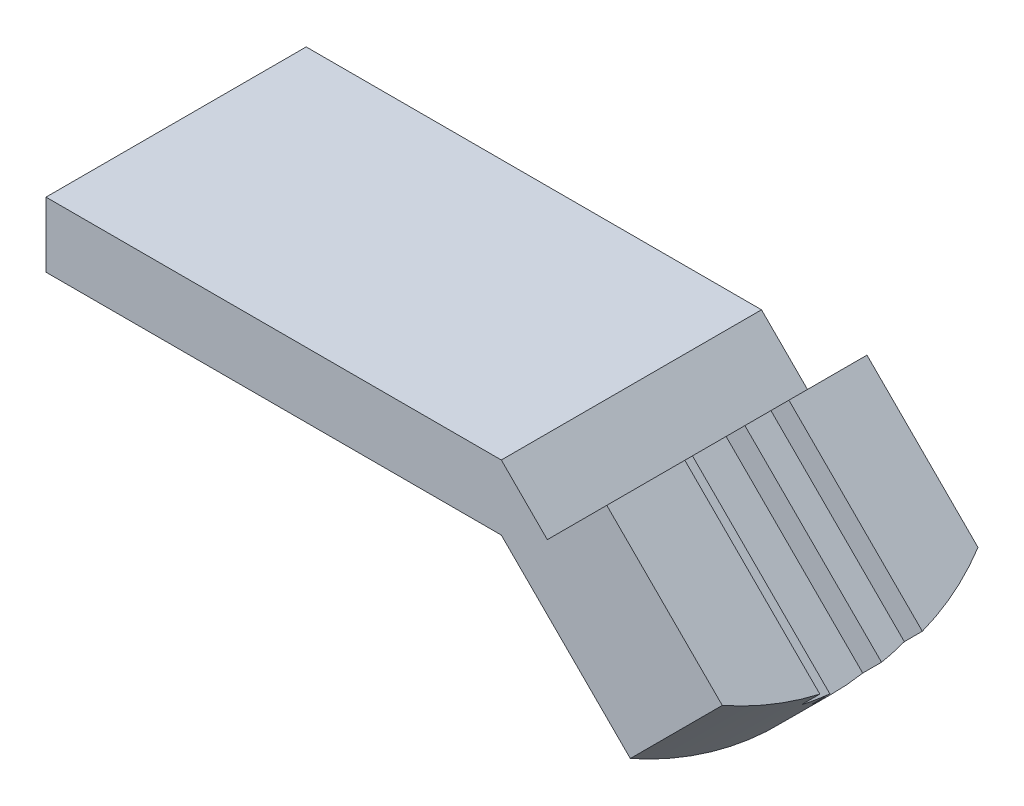
ISO-10303-21;
HEADER;
FILE_DESCRIPTION(('STEP AP214'),'2;1');
FILE_NAME('part.step','',(''),(''),'','','');
FILE_SCHEMA(('AUTOMOTIVE_DESIGN { 1 0 10303 214 1 1 1 1 }'));
ENDSEC;
DATA;
#1=APPLICATION_CONTEXT('core data for automotive mechanical design processes');
#2=APPLICATION_PROTOCOL_DEFINITION('international standard','automotive_design',2000,#1);
#3=PRODUCT_CONTEXT('',#1,'mechanical');
#4=PRODUCT('Part','Part','',(#3));
#5=PRODUCT_RELATED_PRODUCT_CATEGORY('part','',(#4));
#6=PRODUCT_DEFINITION_FORMATION('','',#4);
#7=PRODUCT_DEFINITION_CONTEXT('part definition',#1,'design');
#8=PRODUCT_DEFINITION('design','',#6,#7);
#9=PRODUCT_DEFINITION_SHAPE('','',#8);
#10=(LENGTH_UNIT() NAMED_UNIT(*) SI_UNIT(.MILLI.,.METRE.));
#11=(NAMED_UNIT(*) PLANE_ANGLE_UNIT() SI_UNIT($,.RADIAN.));
#12=(NAMED_UNIT(*) SI_UNIT($,.STERADIAN.) SOLID_ANGLE_UNIT());
#13=UNCERTAINTY_MEASURE_WITH_UNIT(LENGTH_MEASURE(1.E-05),#10,'distance_accuracy_value','');
#14=(GEOMETRIC_REPRESENTATION_CONTEXT(3) GLOBAL_UNCERTAINTY_ASSIGNED_CONTEXT((#13)) GLOBAL_UNIT_ASSIGNED_CONTEXT((#10,
#11,#12)) REPRESENTATION_CONTEXT('',''));
#15=CARTESIAN_POINT('',(0.,0.,0.));
#16=DIRECTION('',(0.,0.,1.));
#17=DIRECTION('',(1.,0.,0.));
#18=AXIS2_PLACEMENT_3D('',#15,#16,#17);
#19=CARTESIAN_POINT('',(53.7132034355964,-4.57106781186547,20.));
#20=DIRECTION('',(-0.707106781186548,-0.707106781186548,0.));
#21=DIRECTION('',(0.707106781186548,-0.707106781186548,0.));
#22=AXIS2_PLACEMENT_3D('',#19,#20,#21);
#23=PLANE('',#22);
#24=CARTESIAN_POINT('',(39.5710678118655,9.57106781186547,10.4207132266221));
#25=DIRECTION('',(-0.707106781186548,-0.707106781186548,0.));
#26=DIRECTION('',(0.707106781186548,-0.707106781186548,0.));
#27=AXIS2_PLACEMENT_3D('',#24,#25,#26);
#28=CIRCLE('',#27,20.);
#29=CARTESIAN_POINT('',(53.484886593816,-4.34275097008512,14.));
#30=VERTEX_POINT('',#29);
#31=CARTESIAN_POINT('',(51.985520375579,-2.84338475184804,20.));
#32=VERTEX_POINT('',#31);
#33=EDGE_CURVE('E172',#30,#32,#28,.T.);
#34=ORIENTED_EDGE('',*,*,#33,.F.);
#35=DIRECTION('',(-0.707106781186548,0.707106781186547,0.));
#36=VECTOR('',#35,1.);
#37=CARTESIAN_POINT('',(143.156261528053,-94.0141259043217,14.));
#38=LINE('',#37,#36);
#39=CARTESIAN_POINT('',(43.1066017177982,6.03553390593274,14.));
#40=VERTEX_POINT('',#39);
#41=EDGE_CURVE('E248',#30,#40,#38,.T.);
#42=ORIENTED_EDGE('',*,*,#41,.T.);
#43=DIRECTION('',(0.,0.,-1.));
#44=VECTOR('',#43,1.);
#45=CARTESIAN_POINT('',(43.1066017177982,6.03553390593274,20.));
#46=LINE('',#45,#44);
#47=CARTESIAN_POINT('',(43.1066017177982,6.03553390593274,20.));
#48=VERTEX_POINT('',#47);
#49=EDGE_CURVE('E210',#48,#40,#46,.T.);
#50=ORIENTED_EDGE('',*,*,#49,.F.);
#51=DIRECTION('',(-0.707106781186548,0.707106781186548,0.));
#52=VECTOR('',#51,1.);
#53=CARTESIAN_POINT('',(53.7132034355964,-4.57106781186547,20.));
#54=LINE('',#53,#52);
#55=EDGE_CURVE('E286',#32,#48,#54,.T.);
#56=ORIENTED_EDGE('',*,*,#55,.F.);
#57=EDGE_LOOP('',(#34,#42,#50,#56));
#58=FACE_BOUND('',#57,.T.);
#59=ADVANCED_FACE('F39',(#58),#23,.F.);
#60=CARTESIAN_POINT('',(39.5710678118655,9.57106781186547,10.4207132266221));
#61=DIRECTION('',(-0.707106781186548,-0.707106781186548,0.));
#62=DIRECTION('',(0.707106781186548,-0.707106781186548,0.));
#63=AXIS2_PLACEMENT_3D('',#60,#61,#62);
#64=CIRCLE('',#63,20.);
#65=CARTESIAN_POINT('',(51.6418742440908,-2.49973862035986,0.));
#66=VERTEX_POINT('',#65);
#67=CARTESIAN_POINT('',(53.3634079789286,-4.22127235519772,6.));
#68=VERTEX_POINT('',#67);
#69=EDGE_CURVE('E55',#66,#68,#64,.T.);
#70=ORIENTED_EDGE('',*,*,#69,.F.);
#71=DIRECTION('',(-0.707106781186548,0.707106781186548,0.));
#72=VECTOR('',#71,1.);
#73=CARTESIAN_POINT('',(53.7132034355964,-4.57106781186547,0.));
#74=LINE('',#73,#72);
#75=CARTESIAN_POINT('',(43.1066017177982,6.03553390593274,0.));
#76=VERTEX_POINT('',#75);
#77=EDGE_CURVE('E168',#66,#76,#74,.T.);
#78=ORIENTED_EDGE('',*,*,#77,.T.);
#79=CARTESIAN_POINT('',(43.1066017177982,6.03553390593274,6.));
#80=VERTEX_POINT('',#79);
#81=EDGE_CURVE('E209',#80,#76,#46,.T.);
#82=ORIENTED_EDGE('',*,*,#81,.F.);
#83=DIRECTION('',(-0.707106781186548,0.707106781186547,0.));
#84=VECTOR('',#83,1.);
#85=CARTESIAN_POINT('',(143.156261528053,-94.0141259043217,6.));
#86=LINE('',#85,#84);
#87=EDGE_CURVE('E170',#68,#80,#86,.T.);
#88=ORIENTED_EDGE('',*,*,#87,.F.);
#89=EDGE_LOOP('',(#70,#78,#82,#88));
#90=FACE_BOUND('',#89,.T.);
#91=ADVANCED_FACE('F166',(#90),#23,.F.);
#92=CARTESIAN_POINT('',(35.,0.,20.));
#93=DIRECTION('',(0.707106781186548,0.707106781186548,0.));
#94=DIRECTION('',(-0.707106781186548,0.707106781186548,0.));
#95=AXIS2_PLACEMENT_3D('',#92,#93,#94);
#96=PLANE('',#95);
#97=CARTESIAN_POINT('',(32.5,2.5,10.4207132266221));
#98=DIRECTION('',(0.707106781186548,0.707106781186548,0.));
#99=DIRECTION('',(-0.707106781186548,0.707106781186548,0.));
#100=AXIS2_PLACEMENT_3D('',#97,#98,#99);
#101=CIRCLE('',#100,20.);
#102=CARTESIAN_POINT('',(44.9144525637135,-9.91445256371352,20.));
#103=VERTEX_POINT('',#102);
#104=CARTESIAN_POINT('',(44.5708064322253,-9.57080643222532,0.));
#105=VERTEX_POINT('',#104);
#106=EDGE_CURVE('E156',#103,#105,#101,.T.);
#107=ORIENTED_EDGE('',*,*,#106,.F.);
#108=DIRECTION('',(0.707106781186548,-0.707106781186548,0.));
#109=VECTOR('',#108,1.);
#110=CARTESIAN_POINT('',(35.,0.,20.));
#111=LINE('',#110,#109);
#112=CARTESIAN_POINT('',(35.,0.,20.));
#113=VERTEX_POINT('',#112);
#114=EDGE_CURVE('E282',#113,#103,#111,.T.);
#115=ORIENTED_EDGE('',*,*,#114,.F.);
#116=DIRECTION('',(0.,0.,-1.));
#117=VECTOR('',#116,1.);
#118=CARTESIAN_POINT('',(35.,0.,20.));
#119=LINE('',#118,#117);
#120=CARTESIAN_POINT('',(35.,0.,0.));
#121=VERTEX_POINT('',#120);
#122=EDGE_CURVE('E214',#113,#121,#119,.T.);
#123=ORIENTED_EDGE('',*,*,#122,.T.);
#124=DIRECTION('',(0.707106781186548,-0.707106781186548,0.));
#125=VECTOR('',#124,1.);
#126=CARTESIAN_POINT('',(35.,0.,0.));
#127=LINE('',#126,#125);
#128=EDGE_CURVE('E180',#121,#105,#127,.T.);
#129=ORIENTED_EDGE('',*,*,#128,.T.);
#130=EDGE_LOOP('',(#107,#115,#123,#129));
#131=FACE_BOUND('',#130,.T.);
#132=ADVANCED_FACE('F307',(#131),#96,.F.);
#133=CARTESIAN_POINT('',(0.,0.,20.));
#134=DIRECTION('',(0.,0.,1.));
#135=DIRECTION('',(1.,0.,0.));
#136=AXIS2_PLACEMENT_3D('',#133,#134,#135);
#137=PLANE('',#136);
#138=ORIENTED_EDGE('',*,*,#114,.T.);
#139=DIRECTION('',(-0.707106781186548,-0.707106781186547,0.));
#140=VECTOR('',#139,1.);
#141=CARTESIAN_POINT('',(105.000908938372,50.1720038109446,20.));
#142=LINE('',#141,#140);
#143=EDGE_CURVE('E162',#32,#103,#142,.T.);
#144=ORIENTED_EDGE('',*,*,#143,.F.);
#145=ORIENTED_EDGE('',*,*,#55,.T.);
#146=DIRECTION('',(-0.707106781186547,-0.707106781186548,0.));
#147=VECTOR('',#146,1.);
#148=CARTESIAN_POINT('',(43.1066017177982,6.03553390593274,20.));
#149=LINE('',#148,#147);
#150=CARTESIAN_POINT('',(38.5355339059327,1.46446609406726,20.));
#151=VERTEX_POINT('',#150);
#152=EDGE_CURVE('E289',#48,#151,#149,.T.);
#153=ORIENTED_EDGE('',*,*,#152,.T.);
#154=DIRECTION('',(-0.707106781186547,0.707106781186548,0.));
#155=VECTOR('',#154,1.);
#156=CARTESIAN_POINT('',(35.,5.,20.));
#157=LINE('',#156,#155);
#158=CARTESIAN_POINT('',(35.,5.,20.));
#159=VERTEX_POINT('',#158);
#160=EDGE_CURVE('E292',#151,#159,#157,.T.);
#161=ORIENTED_EDGE('',*,*,#160,.T.);
#162=DIRECTION('',(-1.,0.,0.));
#163=VECTOR('',#162,1.);
#164=CARTESIAN_POINT('',(0.,5.,20.));
#165=LINE('',#164,#163);
#166=CARTESIAN_POINT('',(0.,5.,20.));
#167=VERTEX_POINT('',#166);
#168=EDGE_CURVE('E201',#159,#167,#165,.T.);
#169=ORIENTED_EDGE('',*,*,#168,.T.);
#170=DIRECTION('',(0.,-1.,0.));
#171=VECTOR('',#170,1.);
#172=CARTESIAN_POINT('',(0.,5.,20.));
#173=LINE('',#172,#171);
#174=CARTESIAN_POINT('',(0.,0.,20.));
#175=VERTEX_POINT('',#174);
#176=EDGE_CURVE('E195',#167,#175,#173,.T.);
#177=ORIENTED_EDGE('',*,*,#176,.T.);
#178=DIRECTION('',(1.,0.,0.));
#179=VECTOR('',#178,1.);
#180=CARTESIAN_POINT('',(0.,0.,20.));
#181=LINE('',#180,#179);
#182=EDGE_CURVE('E279',#175,#113,#181,.T.);
#183=ORIENTED_EDGE('',*,*,#182,.T.);
#184=EDGE_LOOP('',(#138,#144,#145,#153,#161,#169,#177,#183));
#185=FACE_BOUND('',#184,.T.);
#186=ADVANCED_FACE('F310',(#185),#137,.T.);
#187=CARTESIAN_POINT('',(0.,0.,0.));
#188=DIRECTION('',(0.,0.,1.));
#189=DIRECTION('',(1.,0.,0.));
#190=AXIS2_PLACEMENT_3D('',#187,#188,#189);
#191=PLANE('',#190);
#192=DIRECTION('',(-0.707106781186548,-0.707106781186547,0.));
#193=VECTOR('',#192,1.);
#194=CARTESIAN_POINT('',(104.657262806883,50.5156499424328,0.));
#195=LINE('',#194,#193);
#196=EDGE_CURVE('E152',#66,#105,#195,.T.);
#197=ORIENTED_EDGE('',*,*,#196,.T.);
#198=ORIENTED_EDGE('',*,*,#128,.F.);
#199=DIRECTION('',(1.,0.,0.));
#200=VECTOR('',#199,1.);
#201=CARTESIAN_POINT('',(0.,0.,0.));
#202=LINE('',#201,#200);
#203=CARTESIAN_POINT('',(0.,0.,0.));
#204=VERTEX_POINT('',#203);
#205=EDGE_CURVE('E186',#204,#121,#202,.T.);
#206=ORIENTED_EDGE('',*,*,#205,.F.);
#207=DIRECTION('',(0.,-1.,0.));
#208=VECTOR('',#207,1.);
#209=CARTESIAN_POINT('',(0.,5.,0.));
#210=LINE('',#209,#208);
#211=CARTESIAN_POINT('',(0.,5.,0.));
#212=VERTEX_POINT('',#211);
#213=EDGE_CURVE('E275',#212,#204,#210,.T.);
#214=ORIENTED_EDGE('',*,*,#213,.F.);
#215=DIRECTION('',(-1.,0.,0.));
#216=VECTOR('',#215,1.);
#217=CARTESIAN_POINT('',(0.,5.,0.));
#218=LINE('',#217,#216);
#219=CARTESIAN_POINT('',(35.,5.,0.));
#220=VERTEX_POINT('',#219);
#221=EDGE_CURVE('E192',#220,#212,#218,.T.);
#222=ORIENTED_EDGE('',*,*,#221,.F.);
#223=DIRECTION('',(-0.707106781186547,0.707106781186548,0.));
#224=VECTOR('',#223,1.);
#225=CARTESIAN_POINT('',(35.,5.,0.));
#226=LINE('',#225,#224);
#227=CARTESIAN_POINT('',(38.5355339059327,1.46446609406726,0.));
#228=VERTEX_POINT('',#227);
#229=EDGE_CURVE('E184',#228,#220,#226,.T.);
#230=ORIENTED_EDGE('',*,*,#229,.F.);
#231=DIRECTION('',(-0.707106781186547,-0.707106781186548,0.));
#232=VECTOR('',#231,1.);
#233=CARTESIAN_POINT('',(43.1066017177982,6.03553390593274,0.));
#234=LINE('',#233,#232);
#235=EDGE_CURVE('E178',#76,#228,#234,.T.);
#236=ORIENTED_EDGE('',*,*,#235,.F.);
#237=ORIENTED_EDGE('',*,*,#77,.F.);
#238=EDGE_LOOP('',(#197,#198,#206,#214,#222,#230,#236,#237));
#239=FACE_BOUND('',#238,.T.);
#240=ADVANCED_FACE('F176',(#239),#191,.F.);
#241=CARTESIAN_POINT('',(143.156261528053,-94.0141259043217,14.));
#242=DIRECTION('',(0.,0.,-1.));
#243=DIRECTION('',(-1.,0.,0.));
#244=AXIS2_PLACEMENT_3D('',#241,#242,#243);
#245=PLANE('',#244);
#246=ORIENTED_EDGE('',*,*,#41,.F.);
#247=DIRECTION('',(-0.707106781186548,-0.707106781186547,0.));
#248=VECTOR('',#247,1.);
#249=CARTESIAN_POINT('',(106.500275156609,48.6726375927075,14.));
#250=LINE('',#249,#248);
#251=CARTESIAN_POINT('',(52.0706730314429,-5.75696453245822,14.));
#252=VERTEX_POINT('',#251);
#253=EDGE_CURVE('E173',#30,#252,#250,.T.);
#254=ORIENTED_EDGE('',*,*,#253,.T.);
#255=DIRECTION('',(-0.707106781186548,0.707106781186547,0.));
#256=VECTOR('',#255,1.);
#257=CARTESIAN_POINT('',(141.74204796568,-95.4283394666949,14.));
#258=LINE('',#257,#256);
#259=CARTESIAN_POINT('',(41.6923881554251,4.62132034355962,14.));
#260=VERTEX_POINT('',#259);
#261=EDGE_CURVE('E62',#252,#260,#258,.T.);
#262=ORIENTED_EDGE('',*,*,#261,.T.);
#263=DIRECTION('',(0.707106781186547,0.707106781186548,0.));
#264=VECTOR('',#263,1.);
#265=CARTESIAN_POINT('',(43.1066017177982,6.03553390593274,14.));
#266=LINE('',#265,#264);
#267=EDGE_CURVE('E48',#260,#40,#266,.T.);
#268=ORIENTED_EDGE('',*,*,#267,.T.);
#269=EDGE_LOOP('',(#246,#254,#262,#268));
#270=FACE_BOUND('',#269,.T.);
#271=ADVANCED_FACE('F247',(#270),#245,.T.);
#272=CARTESIAN_POINT('',(141.74204796568,-95.4283394666949,14.));
#273=DIRECTION('',(0.707106781186547,0.707106781186548,0.));
#274=DIRECTION('',(-0.707106781186548,0.707106781186547,0.));
#275=AXIS2_PLACEMENT_3D('',#272,#273,#274);
#276=PLANE('',#275);
#277=ORIENTED_EDGE('',*,*,#261,.F.);
#278=CARTESIAN_POINT('',(38.1568542494924,8.15685424949235,10.4207132266221));
#279=DIRECTION('',(0.707106781186547,0.707106781186548,0.));
#280=DIRECTION('',(-0.707106781186548,0.707106781186547,0.));
#281=AXIS2_PLACEMENT_3D('',#278,#279,#280);
#282=CIRCLE('',#281,20.);
#283=CARTESIAN_POINT('',(52.254830226338,-5.94112172735326,12.));
#284=VERTEX_POINT('',#283);
#285=EDGE_CURVE('E260',#252,#284,#282,.T.);
#286=ORIENTED_EDGE('',*,*,#285,.T.);
#287=DIRECTION('',(-0.707106781186548,0.707106781186547,0.));
#288=VECTOR('',#287,1.);
#289=CARTESIAN_POINT('',(141.74204796568,-95.4283394666949,12.));
#290=LINE('',#289,#288);
#291=CARTESIAN_POINT('',(41.6923881554251,4.62132034355963,12.));
#292=VERTEX_POINT('',#291);
#293=EDGE_CURVE('E259',#284,#292,#290,.T.);
#294=ORIENTED_EDGE('',*,*,#293,.T.);
#295=DIRECTION('',(0.,0.,1.));
#296=VECTOR('',#295,1.);
#297=CARTESIAN_POINT('',(41.6923881554251,4.62132034355962,20.));
#298=LINE('',#297,#296);
#299=EDGE_CURVE('E242',#292,#260,#298,.T.);
#300=ORIENTED_EDGE('',*,*,#299,.T.);
#301=EDGE_LOOP('',(#277,#286,#294,#300));
#302=FACE_BOUND('',#301,.T.);
#303=ADVANCED_FACE('F256',(#302),#276,.T.);
#304=CARTESIAN_POINT('',(140.327834403307,-96.8425530290679,12.));
#305=DIRECTION('',(0.,0.,-1.));
#306=DIRECTION('',(-1.,0.,0.));
#307=AXIS2_PLACEMENT_3D('',#304,#305,#306);
#308=PLANE('',#307);
#309=ORIENTED_EDGE('',*,*,#293,.F.);
#310=DIRECTION('',(-0.707106781186548,-0.707106781186547,0.));
#311=VECTOR('',#310,1.);
#312=CARTESIAN_POINT('',(106.684432351504,48.4884803978124,12.));
#313=LINE('',#312,#311);
#314=CARTESIAN_POINT('',(50.8406166639649,-7.35533528972635,12.));
#315=VERTEX_POINT('',#314);
#316=EDGE_CURVE('E366',#284,#315,#313,.T.);
#317=ORIENTED_EDGE('',*,*,#316,.T.);
#318=DIRECTION('',(-0.707106781186548,0.707106781186547,0.));
#319=VECTOR('',#318,1.);
#320=CARTESIAN_POINT('',(140.327834403307,-96.8425530290679,12.));
#321=LINE('',#320,#319);
#322=CARTESIAN_POINT('',(40.278174593052,3.20710678118653,12.));
#323=VERTEX_POINT('',#322);
#324=EDGE_CURVE('E264',#315,#323,#321,.T.);
#325=ORIENTED_EDGE('',*,*,#324,.T.);
#326=DIRECTION('',(0.707106781186547,0.707106781186548,0.));
#327=VECTOR('',#326,1.);
#328=CARTESIAN_POINT('',(43.1066017177982,6.03553390593274,12.));
#329=LINE('',#328,#327);
#330=EDGE_CURVE('E238',#323,#292,#329,.T.);
#331=ORIENTED_EDGE('',*,*,#330,.T.);
#332=EDGE_LOOP('',(#309,#317,#325,#331));
#333=FACE_BOUND('',#332,.T.);
#334=ADVANCED_FACE('F407',(#333),#308,.T.);
#335=CARTESIAN_POINT('',(140.327834403307,-96.8425530290679,12.));
#336=DIRECTION('',(0.707106781186547,0.707106781186548,0.));
#337=DIRECTION('',(-0.707106781186548,0.707106781186547,0.));
#338=AXIS2_PLACEMENT_3D('',#335,#336,#337);
#339=PLANE('',#338);
#340=ORIENTED_EDGE('',*,*,#324,.F.);
#341=CARTESIAN_POINT('',(36.7426406871193,6.74264068711928,10.4207132266221));
#342=DIRECTION('',(0.707106781186547,0.707106781186548,0.));
#343=DIRECTION('',(-0.707106781186548,0.707106781186547,0.));
#344=AXIS2_PLACEMENT_3D('',#341,#342,#343);
#345=CIRCLE('',#344,20.);
#346=CARTESIAN_POINT('',(50.7808055863227,-7.29552421208419,8.));
#347=VERTEX_POINT('',#346);
#348=EDGE_CURVE('E347',#315,#347,#345,.T.);
#349=ORIENTED_EDGE('',*,*,#348,.T.);
#350=DIRECTION('',(-0.707106781186548,0.707106781186547,0.));
#351=VECTOR('',#350,1.);
#352=CARTESIAN_POINT('',(140.327834403307,-96.8425530290679,8.));
#353=LINE('',#352,#351);
#354=CARTESIAN_POINT('',(40.278174593052,3.20710678118652,8.));
#355=VERTEX_POINT('',#354);
#356=EDGE_CURVE('E269',#347,#355,#353,.T.);
#357=ORIENTED_EDGE('',*,*,#356,.T.);
#358=DIRECTION('',(0.,0.,1.));
#359=VECTOR('',#358,1.);
#360=CARTESIAN_POINT('',(40.278174593052,3.20710678118653,20.));
#361=LINE('',#360,#359);
#362=EDGE_CURVE('E234',#355,#323,#361,.T.);
#363=ORIENTED_EDGE('',*,*,#362,.T.);
#364=EDGE_LOOP('',(#340,#349,#357,#363));
#365=FACE_BOUND('',#364,.T.);
#366=ADVANCED_FACE('F346',(#365),#339,.T.);
#367=CARTESIAN_POINT('',(140.327834403307,-96.8425530290679,8.));
#368=DIRECTION('',(0.,0.,1.));
#369=DIRECTION('',(1.,0.,0.));
#370=AXIS2_PLACEMENT_3D('',#367,#368,#369);
#371=PLANE('',#370);
#372=ORIENTED_EDGE('',*,*,#356,.F.);
#373=DIRECTION('',(-0.707106781186548,-0.707106781186547,0.));
#374=VECTOR('',#373,1.);
#375=CARTESIAN_POINT('',(106.624621273862,48.5482914754546,8.));
#376=LINE('',#375,#374);
#377=CARTESIAN_POINT('',(52.2260539809139,-5.85027581749302,8.));
#378=VERTEX_POINT('',#377);
#379=EDGE_CURVE('E352',#347,#378,#376,.F.);
#380=ORIENTED_EDGE('',*,*,#379,.T.);
#381=DIRECTION('',(-0.707106781186548,0.707106781186547,0.));
#382=VECTOR('',#381,1.);
#383=CARTESIAN_POINT('',(141.773082797898,-95.3973046344768,8.));
#384=LINE('',#383,#382);
#385=CARTESIAN_POINT('',(41.7234229876432,4.65235517577771,8.));
#386=VERTEX_POINT('',#385);
#387=EDGE_CURVE('E333',#378,#386,#384,.T.);
#388=ORIENTED_EDGE('',*,*,#387,.T.);
#389=DIRECTION('',(-0.707106781186547,-0.707106781186548,0.));
#390=VECTOR('',#389,1.);
#391=CARTESIAN_POINT('',(43.1066017177982,6.03553390593274,8.));
#392=LINE('',#391,#390);
#393=EDGE_CURVE('E230',#386,#355,#392,.T.);
#394=ORIENTED_EDGE('',*,*,#393,.T.);
#395=EDGE_LOOP('',(#372,#380,#388,#394));
#396=FACE_BOUND('',#395,.T.);
#397=ADVANCED_FACE('F350',(#396),#371,.T.);
#398=CARTESIAN_POINT('',(141.773082797898,-95.3973046344768,8.));
#399=DIRECTION('',(0.707106781186547,0.707106781186548,0.));
#400=DIRECTION('',(-0.707106781186548,0.707106781186547,0.));
#401=AXIS2_PLACEMENT_3D('',#398,#399,#400);
#402=PLANE('',#401);
#403=ORIENTED_EDGE('',*,*,#387,.F.);
#404=CARTESIAN_POINT('',(38.1878890817104,8.18788908171044,10.4207132266221));
#405=DIRECTION('',(0.707106781186547,0.707106781186548,0.));
#406=DIRECTION('',(-0.707106781186548,0.707106781186547,0.));
#407=AXIS2_PLACEMENT_3D('',#404,#405,#406);
#408=CIRCLE('',#407,20.);
#409=CARTESIAN_POINT('',(51.9802292487736,-5.60445108535274,6.));
#410=VERTEX_POINT('',#409);
#411=EDGE_CURVE('E356',#378,#410,#408,.T.);
#412=ORIENTED_EDGE('',*,*,#411,.T.);
#413=DIRECTION('',(-0.707106781186548,0.707106781186547,0.));
#414=VECTOR('',#413,1.);
#415=CARTESIAN_POINT('',(141.773082797898,-95.3973046344768,6.));
#416=LINE('',#415,#414);
#417=CARTESIAN_POINT('',(41.7234229876432,4.65235517577771,6.));
#418=VERTEX_POINT('',#417);
#419=EDGE_CURVE('E331',#410,#418,#416,.T.);
#420=ORIENTED_EDGE('',*,*,#419,.T.);
#421=DIRECTION('',(0.,0.,1.));
#422=VECTOR('',#421,1.);
#423=CARTESIAN_POINT('',(41.7234229876432,4.65235517577771,20.));
#424=LINE('',#423,#422);
#425=EDGE_CURVE('E226',#418,#386,#424,.T.);
#426=ORIENTED_EDGE('',*,*,#425,.T.);
#427=EDGE_LOOP('',(#403,#412,#420,#426));
#428=FACE_BOUND('',#427,.T.);
#429=ADVANCED_FACE('F355',(#428),#402,.T.);
#430=CARTESIAN_POINT('',(141.773082797898,-95.3973046344768,6.));
#431=DIRECTION('',(0.,0.,1.));
#432=DIRECTION('',(1.,0.,0.));
#433=AXIS2_PLACEMENT_3D('',#430,#431,#432);
#434=PLANE('',#433);
#435=ORIENTED_EDGE('',*,*,#419,.F.);
#436=DIRECTION('',(-0.707106781186548,-0.707106781186547,0.));
#437=VECTOR('',#436,1.);
#438=CARTESIAN_POINT('',(106.378796541721,48.7941162075949,6.));
#439=LINE('',#438,#437);
#440=EDGE_CURVE('E11',#410,#68,#439,.F.);
#441=ORIENTED_EDGE('',*,*,#440,.T.);
#442=ORIENTED_EDGE('',*,*,#87,.T.);
#443=DIRECTION('',(-0.707106781186547,-0.707106781186548,0.));
#444=VECTOR('',#443,1.);
#445=CARTESIAN_POINT('',(43.1066017177982,6.03553390593274,6.));
#446=LINE('',#445,#444);
#447=EDGE_CURVE('E222',#80,#418,#446,.T.);
#448=ORIENTED_EDGE('',*,*,#447,.T.);
#449=EDGE_LOOP('',(#435,#441,#442,#448));
#450=FACE_BOUND('',#449,.T.);
#451=ADVANCED_FACE('F330',(#450),#434,.T.);
#452=CARTESIAN_POINT('',(43.1066017177982,6.03553390593274,20.));
#453=DIRECTION('',(0.707106781186548,-0.707106781186547,0.));
#454=DIRECTION('',(0.707106781186547,0.707106781186548,0.));
#455=AXIS2_PLACEMENT_3D('',#452,#453,#454);
#456=PLANE('',#455);
#457=ORIENTED_EDGE('',*,*,#267,.F.);
#458=ORIENTED_EDGE('',*,*,#299,.F.);
#459=ORIENTED_EDGE('',*,*,#330,.F.);
#460=ORIENTED_EDGE('',*,*,#362,.F.);
#461=ORIENTED_EDGE('',*,*,#393,.F.);
#462=ORIENTED_EDGE('',*,*,#425,.F.);
#463=ORIENTED_EDGE('',*,*,#447,.F.);
#464=ORIENTED_EDGE('',*,*,#81,.T.);
#465=ORIENTED_EDGE('',*,*,#235,.T.);
#466=DIRECTION('',(0.,0.,-1.));
#467=VECTOR('',#466,1.);
#468=CARTESIAN_POINT('',(38.5355339059327,1.46446609406726,20.));
#469=LINE('',#468,#467);
#470=EDGE_CURVE('E205',#151,#228,#469,.T.);
#471=ORIENTED_EDGE('',*,*,#470,.F.);
#472=ORIENTED_EDGE('',*,*,#152,.F.);
#473=ORIENTED_EDGE('',*,*,#49,.T.);
#474=EDGE_LOOP('',(#457,#458,#459,#460,#461,#462,#463,#464,#465,#471,#472,#473));
#475=FACE_BOUND('',#474,.T.);
#476=ADVANCED_FACE('F251',(#475),#456,.F.);
#477=CARTESIAN_POINT('',(0.,5.,20.));
#478=DIRECTION('',(1.,0.,0.));
#479=DIRECTION('',(0.,1.,0.));
#480=AXIS2_PLACEMENT_3D('',#477,#478,#479);
#481=PLANE('',#480);
#482=ORIENTED_EDGE('',*,*,#213,.T.);
#483=DIRECTION('',(0.,0.,-1.));
#484=VECTOR('',#483,1.);
#485=CARTESIAN_POINT('',(0.,0.,20.));
#486=LINE('',#485,#484);
#487=EDGE_CURVE('E218',#175,#204,#486,.T.);
#488=ORIENTED_EDGE('',*,*,#487,.F.);
#489=ORIENTED_EDGE('',*,*,#176,.F.);
#490=DIRECTION('',(0.,0.,-1.));
#491=VECTOR('',#490,1.);
#492=CARTESIAN_POINT('',(0.,5.,20.));
#493=LINE('',#492,#491);
#494=EDGE_CURVE('E196',#167,#212,#493,.T.);
#495=ORIENTED_EDGE('',*,*,#494,.T.);
#496=EDGE_LOOP('',(#482,#488,#489,#495));
#497=FACE_BOUND('',#496,.T.);
#498=ADVANCED_FACE('F41',(#497),#481,.F.);
#499=CARTESIAN_POINT('',(0.,0.,20.));
#500=DIRECTION('',(0.,1.,0.));
#501=DIRECTION('',(0.,0.,1.));
#502=AXIS2_PLACEMENT_3D('',#499,#500,#501);
#503=PLANE('',#502);
#504=ORIENTED_EDGE('',*,*,#205,.T.);
#505=ORIENTED_EDGE('',*,*,#122,.F.);
#506=ORIENTED_EDGE('',*,*,#182,.F.);
#507=ORIENTED_EDGE('',*,*,#487,.T.);
#508=EDGE_LOOP('',(#504,#505,#506,#507));
#509=FACE_BOUND('',#508,.T.);
#510=ADVANCED_FACE('F302',(#509),#503,.F.);
#511=CARTESIAN_POINT('',(35.,5.,20.));
#512=DIRECTION('',(-0.707106781186548,-0.707106781186547,0.));
#513=DIRECTION('',(0.707106781186547,-0.707106781186548,0.));
#514=AXIS2_PLACEMENT_3D('',#511,#512,#513);
#515=PLANE('',#514);
#516=ORIENTED_EDGE('',*,*,#229,.T.);
#517=DIRECTION('',(0.,0.,-1.));
#518=VECTOR('',#517,1.);
#519=CARTESIAN_POINT('',(35.,5.,20.));
#520=LINE('',#519,#518);
#521=EDGE_CURVE('E200',#159,#220,#520,.T.);
#522=ORIENTED_EDGE('',*,*,#521,.F.);
#523=ORIENTED_EDGE('',*,*,#160,.F.);
#524=ORIENTED_EDGE('',*,*,#470,.T.);
#525=EDGE_LOOP('',(#516,#522,#523,#524));
#526=FACE_BOUND('',#525,.T.);
#527=ADVANCED_FACE('F322',(#526),#515,.F.);
#528=CARTESIAN_POINT('',(0.,5.,20.));
#529=DIRECTION('',(0.,-1.,0.));
#530=DIRECTION('',(0.,0.,-1.));
#531=AXIS2_PLACEMENT_3D('',#528,#529,#530);
#532=PLANE('',#531);
#533=ORIENTED_EDGE('',*,*,#221,.T.);
#534=ORIENTED_EDGE('',*,*,#494,.F.);
#535=ORIENTED_EDGE('',*,*,#168,.F.);
#536=ORIENTED_EDGE('',*,*,#521,.T.);
#537=EDGE_LOOP('',(#533,#534,#535,#536));
#538=FACE_BOUND('',#537,.T.);
#539=ADVANCED_FACE('F318',(#538),#532,.F.);
#540=CARTESIAN_POINT('',(92.5864563746581,62.5864563746581,10.4207132266221));
#541=DIRECTION('',(-0.707106781186548,-0.707106781186547,0.));
#542=DIRECTION('',(0.707106781186547,-0.707106781186548,0.));
#543=AXIS2_PLACEMENT_3D('',#540,#541,#542);
#544=CYLINDRICAL_SURFACE('',#543,20.);
#545=ORIENTED_EDGE('',*,*,#379,.F.);
#546=ORIENTED_EDGE('',*,*,#348,.F.);
#547=ORIENTED_EDGE('',*,*,#316,.F.);
#548=ORIENTED_EDGE('',*,*,#285,.F.);
#549=ORIENTED_EDGE('',*,*,#253,.F.);
#550=ORIENTED_EDGE('',*,*,#33,.T.);
#551=ORIENTED_EDGE('',*,*,#143,.T.);
#552=ORIENTED_EDGE('',*,*,#106,.T.);
#553=ORIENTED_EDGE('',*,*,#196,.F.);
#554=ORIENTED_EDGE('',*,*,#69,.T.);
#555=ORIENTED_EDGE('',*,*,#440,.F.);
#556=ORIENTED_EDGE('',*,*,#411,.F.);
#557=EDGE_LOOP('',(#545,#546,#547,#548,#549,#550,#551,#552,#553,#554,#555,#556));
#558=FACE_BOUND('',#557,.T.);
#559=ADVANCED_FACE('F154',(#558),#544,.T.);
#560=CLOSED_SHELL('',(#59,#91,#132,#186,#240,#271,#303,#334,#366,#397,#429,#451,#476,#498,#510,
#527,#539,#559));
#561=MANIFOLD_SOLID_BREP('B2',#560);
#562=ADVANCED_BREP_SHAPE_REPRESENTATION('',(#18,#561),#14);
#563=SHAPE_DEFINITION_REPRESENTATION(#9,#562);
ENDSEC;
END-ISO-10303-21;
